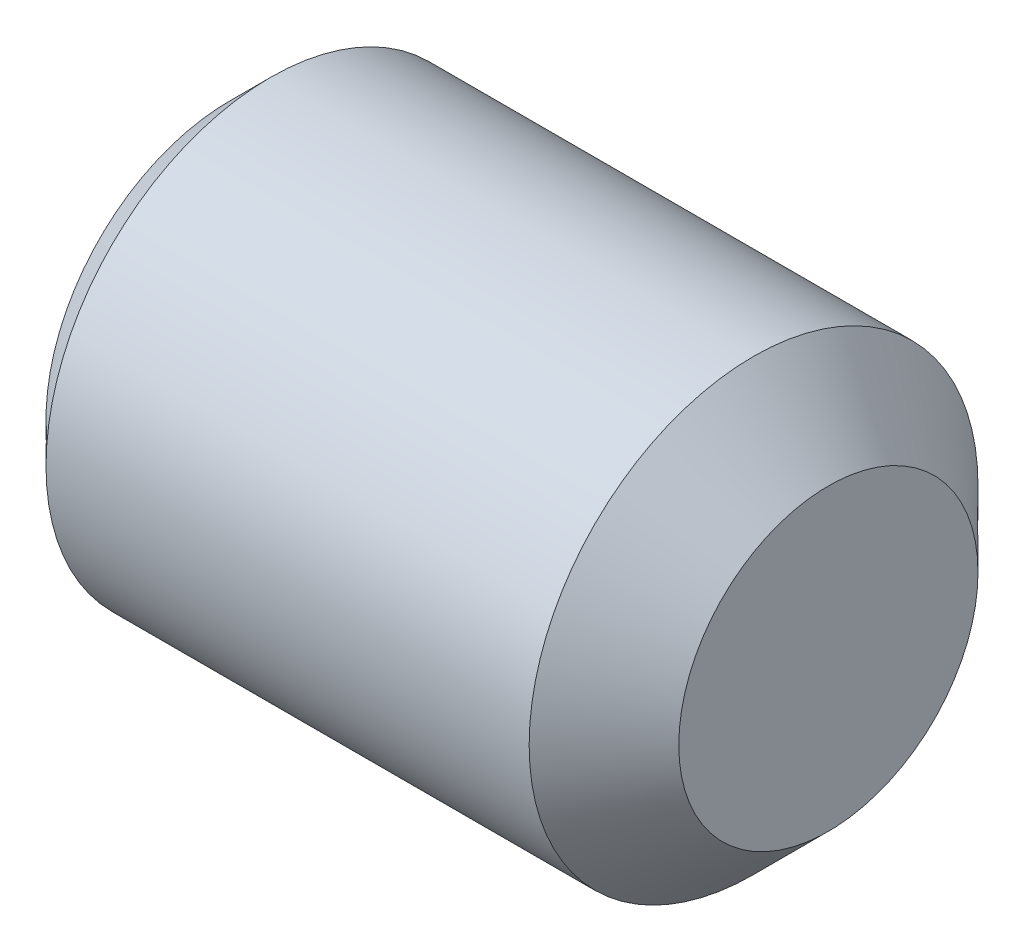
ISO-10303-21;
HEADER;
FILE_DESCRIPTION(('STEP AP214'),'2;1');
FILE_NAME('part.step','',(''),(''),'','','');
FILE_SCHEMA(('AUTOMOTIVE_DESIGN { 1 0 10303 214 1 1 1 1 }'));
ENDSEC;
DATA;
#1=APPLICATION_CONTEXT('core data for automotive mechanical design processes');
#2=APPLICATION_PROTOCOL_DEFINITION('international standard','automotive_design',2000,#1);
#3=PRODUCT_CONTEXT('',#1,'mechanical');
#4=PRODUCT('Part','Part','',(#3));
#5=PRODUCT_RELATED_PRODUCT_CATEGORY('part','',(#4));
#6=PRODUCT_DEFINITION_FORMATION('','',#4);
#7=PRODUCT_DEFINITION_CONTEXT('part definition',#1,'design');
#8=PRODUCT_DEFINITION('design','',#6,#7);
#9=PRODUCT_DEFINITION_SHAPE('','',#8);
#10=(LENGTH_UNIT() NAMED_UNIT(*) SI_UNIT(.MILLI.,.METRE.));
#11=(NAMED_UNIT(*) PLANE_ANGLE_UNIT() SI_UNIT($,.RADIAN.));
#12=(NAMED_UNIT(*) SI_UNIT($,.STERADIAN.) SOLID_ANGLE_UNIT());
#13=UNCERTAINTY_MEASURE_WITH_UNIT(LENGTH_MEASURE(1.E-05),#10,'distance_accuracy_value','');
#14=(GEOMETRIC_REPRESENTATION_CONTEXT(3) GLOBAL_UNCERTAINTY_ASSIGNED_CONTEXT((#13)) GLOBAL_UNIT_ASSIGNED_CONTEXT((#10,
#11,#12)) REPRESENTATION_CONTEXT('',''));
#15=CARTESIAN_POINT('',(0.,0.,0.));
#16=DIRECTION('',(0.,0.,1.));
#17=DIRECTION('',(1.,0.,0.));
#18=AXIS2_PLACEMENT_3D('',#15,#16,#17);
#19=CARTESIAN_POINT('',(-6.00000000000012,0.,0.));
#20=DIRECTION('',(-1.,0.,0.));
#21=DIRECTION('',(0.,0.,1.));
#22=AXIS2_PLACEMENT_3D('',#19,#20,#21);
#23=CONICAL_SURFACE('',#22,1.50000000000006,1.02974425867663);
#24=CARTESIAN_POINT('',(-5.09870907145876,0.,1.11022302462516E-13));
#25=VERTEX_POINT('',#24);
#26=VERTEX_LOOP('',#25);
#27=FACE_BOUND('',#26,.T.);
#28=CARTESIAN_POINT('',(-6.00000000000012,0.,0.));
#29=DIRECTION('',(-1.,0.,0.));
#30=DIRECTION('',(0.,0.,1.));
#31=AXIS2_PLACEMENT_3D('',#28,#29,#30);
#32=CIRCLE('',#31,1.50000000000006);
#33=CARTESIAN_POINT('',(-6.00000000000006,0.750000000000015,-1.29903810567668));
#34=VERTEX_POINT('',#33);
#35=CARTESIAN_POINT('',(-6.00000000000006,1.50000000000003,0.));
#36=VERTEX_POINT('',#35);
#37=EDGE_CURVE('E21',#34,#36,#32,.F.);
#38=ORIENTED_EDGE('',*,*,#37,.F.);
#39=CARTESIAN_POINT('',(-6.00000000000012,0.,0.));
#40=DIRECTION('',(-1.,0.,0.));
#41=DIRECTION('',(0.,0.,1.));
#42=AXIS2_PLACEMENT_3D('',#39,#40,#41);
#43=CIRCLE('',#42,1.50000000000006);
#44=CARTESIAN_POINT('',(-6.00000000000006,-0.750000000000014,-1.29903810567668));
#45=VERTEX_POINT('',#44);
#46=EDGE_CURVE('E95',#45,#34,#43,.F.);
#47=ORIENTED_EDGE('',*,*,#46,.F.);
#48=CARTESIAN_POINT('',(-6.00000000000012,0.,0.));
#49=DIRECTION('',(-1.,0.,0.));
#50=DIRECTION('',(0.,0.,1.));
#51=AXIS2_PLACEMENT_3D('',#48,#49,#50);
#52=CIRCLE('',#51,1.50000000000006);
#53=CARTESIAN_POINT('',(-6.00000000000006,-1.50000000000003,0.));
#54=VERTEX_POINT('',#53);
#55=EDGE_CURVE('E104',#54,#45,#52,.F.);
#56=ORIENTED_EDGE('',*,*,#55,.F.);
#57=CARTESIAN_POINT('',(-6.00000000000012,0.,0.));
#58=DIRECTION('',(-1.,0.,0.));
#59=DIRECTION('',(0.,0.,1.));
#60=AXIS2_PLACEMENT_3D('',#57,#58,#59);
#61=CIRCLE('',#60,1.50000000000006);
#62=CARTESIAN_POINT('',(-6.00000000000006,-0.750000000000015,1.29903810567668));
#63=VERTEX_POINT('',#62);
#64=EDGE_CURVE('E103',#54,#63,#61,.T.);
#65=ORIENTED_EDGE('',*,*,#64,.T.);
#66=CARTESIAN_POINT('',(-6.00000000000012,0.,0.));
#67=DIRECTION('',(-1.,0.,0.));
#68=DIRECTION('',(0.,0.,1.));
#69=AXIS2_PLACEMENT_3D('',#66,#67,#68);
#70=CIRCLE('',#69,1.50000000000006);
#71=CARTESIAN_POINT('',(-6.00000000000006,0.750000000000014,1.29903810567668));
#72=VERTEX_POINT('',#71);
#73=EDGE_CURVE('E127',#63,#72,#70,.T.);
#74=ORIENTED_EDGE('',*,*,#73,.T.);
#75=CARTESIAN_POINT('',(-6.00000000000012,0.,0.));
#76=DIRECTION('',(-1.,0.,0.));
#77=DIRECTION('',(0.,0.,1.));
#78=AXIS2_PLACEMENT_3D('',#75,#76,#77);
#79=CIRCLE('',#78,1.50000000000006);
#80=EDGE_CURVE('E120',#36,#72,#79,.F.);
#81=ORIENTED_EDGE('',*,*,#80,.F.);
#82=EDGE_LOOP('',(#38,#47,#56,#65,#74,#81));
#83=FACE_BOUND('',#82,.T.);
#84=ADVANCED_FACE('F18',(#27,#83),#23,.F.);
#85=CARTESIAN_POINT('',(-6.,0.,0.));
#86=DIRECTION('',(1.,0.,0.));
#87=DIRECTION('',(0.,0.,-1.));
#88=AXIS2_PLACEMENT_3D('',#85,#86,#87);
#89=PLANE('',#88);
#90=DIRECTION('',(0.,0.,1.));
#91=VECTOR('',#90,1.);
#92=CARTESIAN_POINT('',(-6.,-1.5,0.866025403784438));
#93=LINE('',#92,#91);
#94=CARTESIAN_POINT('',(-6.,-1.5,0.866025403784438));
#95=VERTEX_POINT('',#94);
#96=EDGE_CURVE('E151',#95,#54,#93,.F.);
#97=ORIENTED_EDGE('',*,*,#96,.F.);
#98=DIRECTION('',(0.,0.866025403784439,0.5));
#99=VECTOR('',#98,1.);
#100=CARTESIAN_POINT('',(-6.,0.,1.73205080756888));
#101=LINE('',#100,#99);
#102=EDGE_CURVE('E145',#63,#95,#101,.F.);
#103=ORIENTED_EDGE('',*,*,#102,.F.);
#104=ORIENTED_EDGE('',*,*,#64,.F.);
#105=EDGE_LOOP('',(#97,#103,#104));
#106=FACE_BOUND('',#105,.T.);
#107=ADVANCED_FACE('F341',(#106),#89,.F.);
#108=CARTESIAN_POINT('',(-6.,0.,0.));
#109=DIRECTION('',(1.,0.,0.));
#110=DIRECTION('',(0.,0.,-1.));
#111=AXIS2_PLACEMENT_3D('',#108,#109,#110);
#112=PLANE('',#111);
#113=DIRECTION('',(0.,0.866025403784439,0.5));
#114=VECTOR('',#113,1.);
#115=CARTESIAN_POINT('',(-6.,0.,1.73205080756888));
#116=LINE('',#115,#114);
#117=CARTESIAN_POINT('',(-6.,0.,1.73205080756888));
#118=VERTEX_POINT('',#117);
#119=EDGE_CURVE('E144',#118,#63,#116,.F.);
#120=ORIENTED_EDGE('',*,*,#119,.F.);
#121=DIRECTION('',(0.,0.866025403784439,-0.5));
#122=VECTOR('',#121,1.);
#123=CARTESIAN_POINT('',(-6.,1.5,0.866025403784438));
#124=LINE('',#123,#122);
#125=EDGE_CURVE('E160',#72,#118,#124,.F.);
#126=ORIENTED_EDGE('',*,*,#125,.F.);
#127=ORIENTED_EDGE('',*,*,#73,.F.);
#128=EDGE_LOOP('',(#120,#126,#127));
#129=FACE_BOUND('',#128,.T.);
#130=ADVANCED_FACE('F331',(#129),#112,.F.);
#131=CARTESIAN_POINT('',(-6.,0.,1.73205080756888));
#132=DIRECTION('',(0.,0.5,-0.866025403784439));
#133=DIRECTION('',(0.,0.866025403784439,0.5));
#134=AXIS2_PLACEMENT_3D('',#131,#132,#133);
#135=PLANE('',#134);
#136=ORIENTED_EDGE('',*,*,#102,.T.);
#137=DIRECTION('',(1.,0.,0.));
#138=VECTOR('',#137,1.);
#139=CARTESIAN_POINT('',(-6.,-1.5,0.866025403784438));
#140=LINE('',#139,#138);
#141=CARTESIAN_POINT('',(-8.,-1.5,0.866025403784438));
#142=VERTEX_POINT('',#141);
#143=EDGE_CURVE('E148',#142,#95,#140,.T.);
#144=ORIENTED_EDGE('',*,*,#143,.F.);
#145=DIRECTION('',(0.,0.866025403784439,0.5));
#146=VECTOR('',#145,1.);
#147=CARTESIAN_POINT('',(-8.,0.,1.73205080756888));
#148=LINE('',#147,#146);
#149=CARTESIAN_POINT('',(-8.,0.,1.73205080756888));
#150=VERTEX_POINT('',#149);
#151=EDGE_CURVE('E129',#142,#150,#148,.T.);
#152=ORIENTED_EDGE('',*,*,#151,.T.);
#153=DIRECTION('',(1.,0.,0.));
#154=VECTOR('',#153,1.);
#155=CARTESIAN_POINT('',(-6.,0.,1.73205080756888));
#156=LINE('',#155,#154);
#157=EDGE_CURVE('E156',#118,#150,#156,.F.);
#158=ORIENTED_EDGE('',*,*,#157,.F.);
#159=ORIENTED_EDGE('',*,*,#119,.T.);
#160=EDGE_LOOP('',(#136,#144,#152,#158,#159));
#161=FACE_BOUND('',#160,.T.);
#162=ADVANCED_FACE('F321',(#161),#135,.T.);
#163=CARTESIAN_POINT('',(-6.,-1.5,0.866025403784438));
#164=DIRECTION('',(0.,1.,0.));
#165=DIRECTION('',(0.,0.,1.));
#166=AXIS2_PLACEMENT_3D('',#163,#164,#165);
#167=PLANE('',#166);
#168=DIRECTION('',(0.,0.,-1.));
#169=VECTOR('',#168,1.);
#170=CARTESIAN_POINT('',(-6.,-1.5,0.));
#171=LINE('',#170,#169);
#172=CARTESIAN_POINT('',(-6.,-1.5,-0.866025403784439));
#173=VERTEX_POINT('',#172);
#174=EDGE_CURVE('E141',#54,#173,#171,.T.);
#175=ORIENTED_EDGE('',*,*,#174,.T.);
#176=DIRECTION('',(1.,0.,0.));
#177=VECTOR('',#176,1.);
#178=CARTESIAN_POINT('',(-6.,-1.5,-0.866025403784439));
#179=LINE('',#178,#177);
#180=CARTESIAN_POINT('',(-8.,-1.5,-0.866025403784439));
#181=VERTEX_POINT('',#180);
#182=EDGE_CURVE('E165',#181,#173,#179,.T.);
#183=ORIENTED_EDGE('',*,*,#182,.F.);
#184=DIRECTION('',(0.,0.,1.));
#185=VECTOR('',#184,1.);
#186=CARTESIAN_POINT('',(-8.,-1.5,0.866025403784438));
#187=LINE('',#186,#185);
#188=EDGE_CURVE('E147',#181,#142,#187,.T.);
#189=ORIENTED_EDGE('',*,*,#188,.T.);
#190=ORIENTED_EDGE('',*,*,#143,.T.);
#191=ORIENTED_EDGE('',*,*,#96,.T.);
#192=EDGE_LOOP('',(#175,#183,#189,#190,#191));
#193=FACE_BOUND('',#192,.T.);
#194=ADVANCED_FACE('F311',(#193),#167,.T.);
#195=CARTESIAN_POINT('',(-6.,0.,0.));
#196=DIRECTION('',(1.,0.,0.));
#197=DIRECTION('',(0.,0.,-1.));
#198=AXIS2_PLACEMENT_3D('',#195,#196,#197);
#199=PLANE('',#198);
#200=DIRECTION('',(0.,-0.866025403784439,0.5));
#201=VECTOR('',#200,1.);
#202=CARTESIAN_POINT('',(-6.,-1.5,-0.866025403784439));
#203=LINE('',#202,#201);
#204=EDGE_CURVE('E168',#173,#45,#203,.F.);
#205=ORIENTED_EDGE('',*,*,#204,.F.);
#206=ORIENTED_EDGE('',*,*,#174,.F.);
#207=ORIENTED_EDGE('',*,*,#55,.T.);
#208=EDGE_LOOP('',(#205,#206,#207));
#209=FACE_BOUND('',#208,.T.);
#210=ADVANCED_FACE('F302',(#209),#199,.F.);
#211=CARTESIAN_POINT('',(-6.,0.,0.));
#212=DIRECTION('',(1.,0.,0.));
#213=DIRECTION('',(0.,0.,-1.));
#214=AXIS2_PLACEMENT_3D('',#211,#212,#213);
#215=PLANE('',#214);
#216=DIRECTION('',(0.,0.866025403784439,-0.5));
#217=VECTOR('',#216,1.);
#218=CARTESIAN_POINT('',(-6.,1.5,0.866025403784438));
#219=LINE('',#218,#217);
#220=CARTESIAN_POINT('',(-6.,1.5,0.866025403784438));
#221=VERTEX_POINT('',#220);
#222=EDGE_CURVE('E140',#221,#72,#219,.F.);
#223=ORIENTED_EDGE('',*,*,#222,.F.);
#224=DIRECTION('',(0.,0.,-1.));
#225=VECTOR('',#224,1.);
#226=CARTESIAN_POINT('',(-6.,1.5,-0.866025403784438));
#227=LINE('',#226,#225);
#228=EDGE_CURVE('E174',#36,#221,#227,.F.);
#229=ORIENTED_EDGE('',*,*,#228,.F.);
#230=ORIENTED_EDGE('',*,*,#80,.T.);
#231=EDGE_LOOP('',(#223,#229,#230));
#232=FACE_BOUND('',#231,.T.);
#233=ADVANCED_FACE('F292',(#232),#215,.F.);
#234=CARTESIAN_POINT('',(-6.,1.5,0.866025403784438));
#235=DIRECTION('',(0.,-0.5,-0.866025403784439));
#236=DIRECTION('',(0.,0.866025403784439,-0.5));
#237=AXIS2_PLACEMENT_3D('',#234,#235,#236);
#238=PLANE('',#237);
#239=ORIENTED_EDGE('',*,*,#125,.T.);
#240=ORIENTED_EDGE('',*,*,#157,.T.);
#241=DIRECTION('',(0.,0.866025403784439,-0.5));
#242=VECTOR('',#241,1.);
#243=CARTESIAN_POINT('',(-8.,1.5,0.866025403784438));
#244=LINE('',#243,#242);
#245=CARTESIAN_POINT('',(-8.,1.5,0.866025403784438));
#246=VERTEX_POINT('',#245);
#247=EDGE_CURVE('E137',#150,#246,#244,.T.);
#248=ORIENTED_EDGE('',*,*,#247,.T.);
#249=DIRECTION('',(1.,0.,0.));
#250=VECTOR('',#249,1.);
#251=CARTESIAN_POINT('',(-6.,1.5,0.866025403784438));
#252=LINE('',#251,#250);
#253=EDGE_CURVE('E172',#221,#246,#252,.F.);
#254=ORIENTED_EDGE('',*,*,#253,.F.);
#255=ORIENTED_EDGE('',*,*,#222,.T.);
#256=EDGE_LOOP('',(#239,#240,#248,#254,#255));
#257=FACE_BOUND('',#256,.T.);
#258=ADVANCED_FACE('F282',(#257),#238,.T.);
#259=CARTESIAN_POINT('',(-6.,-1.5,-0.866025403784439));
#260=DIRECTION('',(0.,0.5,0.866025403784439));
#261=DIRECTION('',(0.,-0.866025403784439,0.5));
#262=AXIS2_PLACEMENT_3D('',#259,#260,#261);
#263=PLANE('',#262);
#264=DIRECTION('',(0.,0.866025403784438,-0.500000000000001));
#265=VECTOR('',#264,1.);
#266=CARTESIAN_POINT('',(-6.,-0.75,-1.29903810567666));
#267=LINE('',#266,#265);
#268=CARTESIAN_POINT('',(-6.,0.,-1.73205080756888));
#269=VERTEX_POINT('',#268);
#270=EDGE_CURVE('E100',#45,#269,#267,.T.);
#271=ORIENTED_EDGE('',*,*,#270,.T.);
#272=DIRECTION('',(1.,0.,0.));
#273=VECTOR('',#272,1.);
#274=CARTESIAN_POINT('',(-6.,0.,-1.73205080756888));
#275=LINE('',#274,#273);
#276=CARTESIAN_POINT('',(-8.,0.,-1.73205080756888));
#277=VERTEX_POINT('',#276);
#278=EDGE_CURVE('E112',#277,#269,#275,.T.);
#279=ORIENTED_EDGE('',*,*,#278,.F.);
#280=DIRECTION('',(0.,-0.866025403784439,0.5));
#281=VECTOR('',#280,1.);
#282=CARTESIAN_POINT('',(-8.,-1.5,-0.866025403784439));
#283=LINE('',#282,#281);
#284=EDGE_CURVE('E159',#277,#181,#283,.T.);
#285=ORIENTED_EDGE('',*,*,#284,.T.);
#286=ORIENTED_EDGE('',*,*,#182,.T.);
#287=ORIENTED_EDGE('',*,*,#204,.T.);
#288=EDGE_LOOP('',(#271,#279,#285,#286,#287));
#289=FACE_BOUND('',#288,.T.);
#290=ADVANCED_FACE('F273',(#289),#263,.T.);
#291=CARTESIAN_POINT('',(-6.,0.,0.));
#292=DIRECTION('',(1.,0.,0.));
#293=DIRECTION('',(0.,0.,-1.));
#294=AXIS2_PLACEMENT_3D('',#291,#292,#293);
#295=PLANE('',#294);
#296=DIRECTION('',(0.,-0.866025403784439,-0.5));
#297=VECTOR('',#296,1.);
#298=CARTESIAN_POINT('',(-6.,0.,-1.73205080756888));
#299=LINE('',#298,#297);
#300=EDGE_CURVE('E98',#269,#34,#299,.F.);
#301=ORIENTED_EDGE('',*,*,#300,.F.);
#302=ORIENTED_EDGE('',*,*,#270,.F.);
#303=ORIENTED_EDGE('',*,*,#46,.T.);
#304=EDGE_LOOP('',(#301,#302,#303));
#305=FACE_BOUND('',#304,.T.);
#306=ADVANCED_FACE('F97',(#305),#295,.F.);
#307=CARTESIAN_POINT('',(-6.,0.,0.));
#308=DIRECTION('',(1.,0.,0.));
#309=DIRECTION('',(0.,0.,-1.));
#310=AXIS2_PLACEMENT_3D('',#307,#308,#309);
#311=PLANE('',#310);
#312=DIRECTION('',(0.,0.,-1.));
#313=VECTOR('',#312,1.);
#314=CARTESIAN_POINT('',(-6.,1.5,-0.866025403784438));
#315=LINE('',#314,#313);
#316=CARTESIAN_POINT('',(-6.,1.5,-0.866025403784438));
#317=VERTEX_POINT('',#316);
#318=EDGE_CURVE('E115',#317,#36,#315,.F.);
#319=ORIENTED_EDGE('',*,*,#318,.F.);
#320=DIRECTION('',(0.,-0.866025403784439,-0.5));
#321=VECTOR('',#320,1.);
#322=CARTESIAN_POINT('',(-6.,0.,-1.73205080756888));
#323=LINE('',#322,#321);
#324=EDGE_CURVE('E109',#34,#317,#323,.F.);
#325=ORIENTED_EDGE('',*,*,#324,.F.);
#326=ORIENTED_EDGE('',*,*,#37,.T.);
#327=EDGE_LOOP('',(#319,#325,#326));
#328=FACE_BOUND('',#327,.T.);
#329=ADVANCED_FACE('F114',(#328),#311,.F.);
#330=CARTESIAN_POINT('',(-6.,1.5,-0.866025403784438));
#331=DIRECTION('',(0.,-1.,0.));
#332=DIRECTION('',(0.,0.,-1.));
#333=AXIS2_PLACEMENT_3D('',#330,#331,#332);
#334=PLANE('',#333);
#335=ORIENTED_EDGE('',*,*,#228,.T.);
#336=ORIENTED_EDGE('',*,*,#253,.T.);
#337=DIRECTION('',(0.,0.,-1.));
#338=VECTOR('',#337,1.);
#339=CARTESIAN_POINT('',(-8.,1.5,-0.866025403784438));
#340=LINE('',#339,#338);
#341=CARTESIAN_POINT('',(-8.,1.5,-0.866025403784438));
#342=VERTEX_POINT('',#341);
#343=EDGE_CURVE('E36',#246,#342,#340,.T.);
#344=ORIENTED_EDGE('',*,*,#343,.T.);
#345=DIRECTION('',(1.,0.,0.));
#346=VECTOR('',#345,1.);
#347=CARTESIAN_POINT('',(-6.,1.5,-0.866025403784438));
#348=LINE('',#347,#346);
#349=EDGE_CURVE('E116',#317,#342,#348,.F.);
#350=ORIENTED_EDGE('',*,*,#349,.F.);
#351=ORIENTED_EDGE('',*,*,#318,.T.);
#352=EDGE_LOOP('',(#335,#336,#344,#350,#351));
#353=FACE_BOUND('',#352,.T.);
#354=ADVANCED_FACE('F208',(#353),#334,.T.);
#355=CARTESIAN_POINT('',(-6.,0.,-1.73205080756888));
#356=DIRECTION('',(0.,-0.5,0.866025403784439));
#357=DIRECTION('',(0.,-0.866025403784439,-0.5));
#358=AXIS2_PLACEMENT_3D('',#355,#356,#357);
#359=PLANE('',#358);
#360=ORIENTED_EDGE('',*,*,#324,.T.);
#361=ORIENTED_EDGE('',*,*,#349,.T.);
#362=DIRECTION('',(0.,-0.866025403784439,-0.5));
#363=VECTOR('',#362,1.);
#364=CARTESIAN_POINT('',(-8.,1.5,-0.866025403784438));
#365=LINE('',#364,#363);
#366=EDGE_CURVE('E134',#342,#277,#365,.T.);
#367=ORIENTED_EDGE('',*,*,#366,.T.);
#368=ORIENTED_EDGE('',*,*,#278,.T.);
#369=ORIENTED_EDGE('',*,*,#300,.T.);
#370=EDGE_LOOP('',(#360,#361,#367,#368,#369));
#371=FACE_BOUND('',#370,.T.);
#372=ADVANCED_FACE('F108',(#371),#359,.T.);
#373=CARTESIAN_POINT('',(0.,0.,0.));
#374=DIRECTION('',(-1.,0.,0.));
#375=DIRECTION('',(0.,0.,1.));
#376=AXIS2_PLACEMENT_3D('',#373,#374,#375);
#377=PLANE('',#376);
#378=CARTESIAN_POINT('',(0.,0.,0.));
#379=DIRECTION('',(-1.,0.,0.));
#380=DIRECTION('',(0.,0.,1.));
#381=AXIS2_PLACEMENT_3D('',#378,#379,#380);
#382=CIRCLE('',#381,2.00000000006639);
#383=CARTESIAN_POINT('',(0.,0.,2.00000000006639));
#384=VERTEX_POINT('',#383);
#385=EDGE_CURVE('E130',#384,#384,#382,.T.);
#386=ORIENTED_EDGE('',*,*,#385,.F.);
#387=EDGE_LOOP('',(#386));
#388=FACE_BOUND('',#387,.T.);
#389=ADVANCED_FACE('F198',(#388),#377,.F.);
#390=CARTESIAN_POINT('',(-8.,3.,0.));
#391=DIRECTION('',(1.,0.,0.));
#392=DIRECTION('',(0.,0.,-1.));
#393=AXIS2_PLACEMENT_3D('',#390,#391,#392);
#394=PLANE('',#393);
#395=ORIENTED_EDGE('',*,*,#343,.F.);
#396=ORIENTED_EDGE('',*,*,#247,.F.);
#397=ORIENTED_EDGE('',*,*,#151,.F.);
#398=ORIENTED_EDGE('',*,*,#188,.F.);
#399=ORIENTED_EDGE('',*,*,#284,.F.);
#400=ORIENTED_EDGE('',*,*,#366,.F.);
#401=EDGE_LOOP('',(#395,#396,#397,#398,#399,#400));
#402=FACE_BOUND('',#401,.T.);
#403=CARTESIAN_POINT('',(-7.99999999992451,0.,0.));
#404=DIRECTION('',(1.,0.,0.));
#405=DIRECTION('',(0.,0.,-1.));
#406=AXIS2_PLACEMENT_3D('',#403,#404,#405);
#407=CIRCLE('',#406,2.45849999993197);
#408=CARTESIAN_POINT('',(-7.99999999992451,0.,-2.45849999993197));
#409=VERTEX_POINT('',#408);
#410=EDGE_CURVE('E133',#409,#409,#407,.T.);
#411=ORIENTED_EDGE('',*,*,#410,.F.);
#412=EDGE_LOOP('',(#411));
#413=FACE_BOUND('',#412,.T.);
#414=ADVANCED_FACE('F194',(#402,#413),#394,.F.);
#415=CARTESIAN_POINT('',(-1.0000000000332,0.,0.));
#416=DIRECTION('',(-1.,0.,0.));
#417=DIRECTION('',(0.,0.,1.));
#418=AXIS2_PLACEMENT_3D('',#415,#416,#417);
#419=CONICAL_SURFACE('',#418,3.00000000004275,0.785398163369027);
#420=CARTESIAN_POINT('',(-1.,0.,0.));
#421=DIRECTION('',(-1.,0.,0.));
#422=DIRECTION('',(0.,0.,1.));
#423=AXIS2_PLACEMENT_3D('',#420,#421,#422);
#424=CIRCLE('',#423,3.);
#425=CARTESIAN_POINT('',(-1.,0.,3.));
#426=VERTEX_POINT('',#425);
#427=EDGE_CURVE('E27',#426,#426,#424,.T.);
#428=ORIENTED_EDGE('',*,*,#427,.F.);
#429=EDGE_LOOP('',(#428));
#430=FACE_BOUND('',#429,.T.);
#431=ORIENTED_EDGE('',*,*,#385,.T.);
#432=EDGE_LOOP('',(#431));
#433=FACE_BOUND('',#432,.T.);
#434=ADVANCED_FACE('F190',(#430,#433),#419,.T.);
#435=CARTESIAN_POINT('',(-7.45849999987058,0.,0.));
#436=DIRECTION('',(1.,0.,0.));
#437=DIRECTION('',(0.,0.,-1.));
#438=AXIS2_PLACEMENT_3D('',#435,#436,#437);
#439=CONICAL_SURFACE('',#438,3.00000000004275,0.785398163449935);
#440=CARTESIAN_POINT('',(-7.45849999999999,0.,0.));
#441=DIRECTION('',(-1.,0.,0.));
#442=DIRECTION('',(0.,0.,1.));
#443=AXIS2_PLACEMENT_3D('',#440,#441,#442);
#444=CIRCLE('',#443,3.);
#445=CARTESIAN_POINT('',(-7.45849999999999,0.,3.));
#446=VERTEX_POINT('',#445);
#447=EDGE_CURVE('E11',#446,#446,#444,.F.);
#448=ORIENTED_EDGE('',*,*,#447,.F.);
#449=EDGE_LOOP('',(#448));
#450=FACE_BOUND('',#449,.T.);
#451=ORIENTED_EDGE('',*,*,#410,.T.);
#452=EDGE_LOOP('',(#451));
#453=FACE_BOUND('',#452,.T.);
#454=ADVANCED_FACE('F193',(#450,#453),#439,.T.);
#455=CARTESIAN_POINT('',(-6.64232706944173,0.,0.));
#456=DIRECTION('',(-1.,0.,0.));
#457=DIRECTION('',(0.,0.,1.));
#458=AXIS2_PLACEMENT_3D('',#455,#456,#457);
#459=CYLINDRICAL_SURFACE('',#458,3.);
#460=ORIENTED_EDGE('',*,*,#447,.T.);
#461=EDGE_LOOP('',(#460));
#462=FACE_BOUND('',#461,.T.);
#463=ORIENTED_EDGE('',*,*,#427,.T.);
#464=EDGE_LOOP('',(#463));
#465=FACE_BOUND('',#464,.T.);
#466=ADVANCED_FACE('F188',(#462,#465),#459,.T.);
#467=CLOSED_SHELL('',(#84,#107,#130,#162,#194,#210,#233,#258,#290,#306,#329,#354,#372,#389,#414,
#434,#454,#466));
#468=MANIFOLD_SOLID_BREP('B1',#467);
#469=ADVANCED_BREP_SHAPE_REPRESENTATION('',(#18,#468),#14);
#470=SHAPE_DEFINITION_REPRESENTATION(#9,#469);
ENDSEC;
END-ISO-10303-21;
